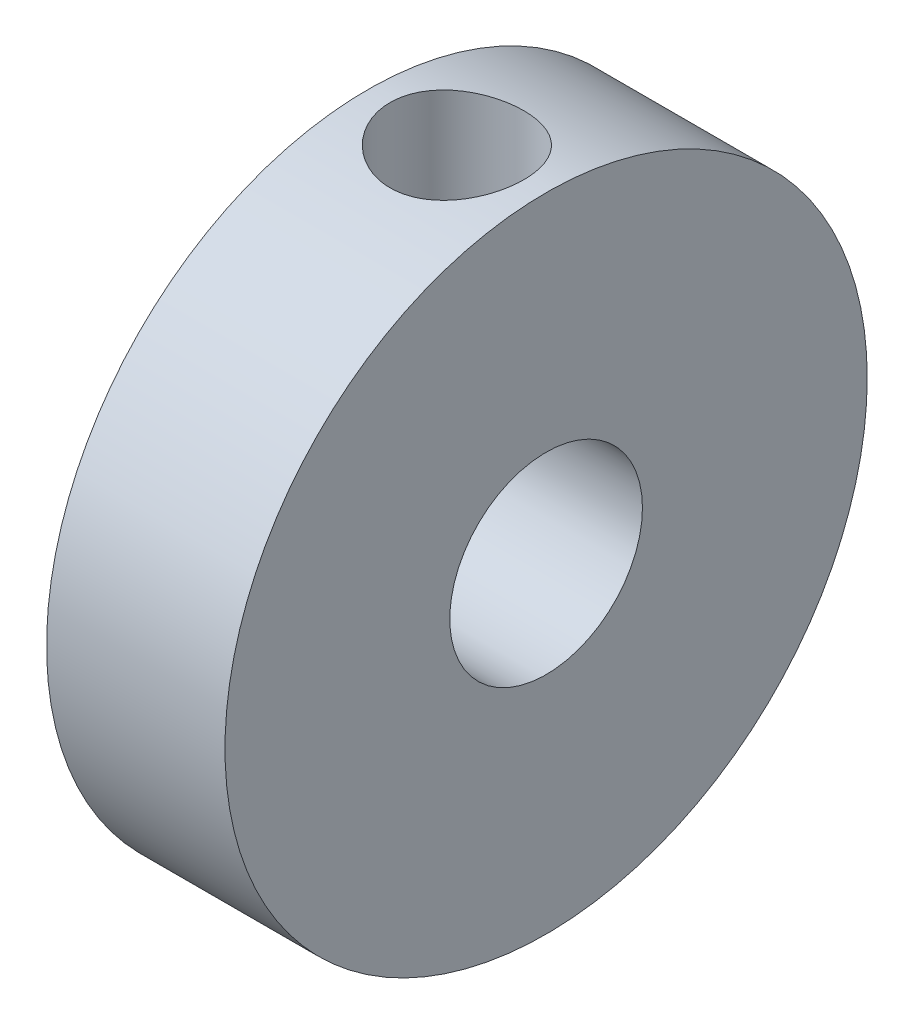
ISO-10303-21;
HEADER;
FILE_DESCRIPTION(('STEP AP214'),'2;1');
FILE_NAME('part.step','',(''),(''),'','','');
FILE_SCHEMA(('AUTOMOTIVE_DESIGN { 1 0 10303 214 1 1 1 1 }'));
ENDSEC;
DATA;
#1=APPLICATION_CONTEXT('core data for automotive mechanical design processes');
#2=APPLICATION_PROTOCOL_DEFINITION('international standard','automotive_design',2000,#1);
#3=PRODUCT_CONTEXT('',#1,'mechanical');
#4=PRODUCT('Part','Part','',(#3));
#5=PRODUCT_RELATED_PRODUCT_CATEGORY('part','',(#4));
#6=PRODUCT_DEFINITION_FORMATION('','',#4);
#7=PRODUCT_DEFINITION_CONTEXT('part definition',#1,'design');
#8=PRODUCT_DEFINITION('design','',#6,#7);
#9=PRODUCT_DEFINITION_SHAPE('','',#8);
#10=(LENGTH_UNIT() NAMED_UNIT(*) SI_UNIT(.MILLI.,.METRE.));
#11=(NAMED_UNIT(*) PLANE_ANGLE_UNIT() SI_UNIT($,.RADIAN.));
#12=(NAMED_UNIT(*) SI_UNIT($,.STERADIAN.) SOLID_ANGLE_UNIT());
#13=UNCERTAINTY_MEASURE_WITH_UNIT(LENGTH_MEASURE(1.E-05),#10,'distance_accuracy_value','');
#14=(GEOMETRIC_REPRESENTATION_CONTEXT(3) GLOBAL_UNCERTAINTY_ASSIGNED_CONTEXT((#13)) GLOBAL_UNIT_ASSIGNED_CONTEXT((#10,
#11,#12)) REPRESENTATION_CONTEXT('',''));
#15=CARTESIAN_POINT('',(0.,0.,0.));
#16=DIRECTION('',(0.,0.,1.));
#17=DIRECTION('',(1.,0.,0.));
#18=AXIS2_PLACEMENT_3D('',#15,#16,#17);
#19=CARTESIAN_POINT('',(6.35,0.,0.));
#20=DIRECTION('',(-1.,0.,0.));
#21=DIRECTION('',(0.,0.,1.));
#22=AXIS2_PLACEMENT_3D('',#19,#20,#21);
#23=CYLINDRICAL_SURFACE('',#22,11.43);
#24=CARTESIAN_POINT('',(6.35,0.,0.));
#25=DIRECTION('',(1.,0.,0.));
#26=DIRECTION('',(0.,0.,-1.));
#27=AXIS2_PLACEMENT_3D('',#24,#25,#26);
#28=CIRCLE('',#27,11.43);
#29=CARTESIAN_POINT('',(6.35,0.,-11.43));
#30=VERTEX_POINT('',#29);
#31=EDGE_CURVE('E10',#30,#30,#28,.T.);
#32=ORIENTED_EDGE('',*,*,#31,.F.);
#33=EDGE_LOOP('',(#32));
#34=FACE_BOUND('',#33,.T.);
#35=CARTESIAN_POINT('',(0.,0.,0.));
#36=DIRECTION('',(1.,0.,0.));
#37=DIRECTION('',(0.,0.,-1.));
#38=AXIS2_PLACEMENT_3D('',#35,#36,#37);
#39=CIRCLE('',#38,11.43);
#40=CARTESIAN_POINT('',(0.,0.,-11.43));
#41=VERTEX_POINT('',#40);
#42=EDGE_CURVE('E51',#41,#41,#39,.T.);
#43=ORIENTED_EDGE('',*,*,#42,.T.);
#44=EDGE_LOOP('',(#43));
#45=FACE_BOUND('',#44,.T.);
#46=CARTESIAN_POINT('',(3.175,11.179201601076,-2.38125));
#47=CARTESIAN_POINT('',(3.04281087813565,11.1792042585459,-2.38124525421922));
#48=CARTESIAN_POINT('',(2.91056319331057,11.1815717298695,-2.37020537071696));
#49=CARTESIAN_POINT('',(2.64981756551108,11.1907703968263,-2.32637931790323));
#50=CARTESIAN_POINT('',(2.52132257576038,11.1976050140344,-2.29357647913844));
#51=CARTESIAN_POINT('',(2.27189212974946,11.2149310809266,-2.2072929725128));
#52=CARTESIAN_POINT('',(2.15094896963558,11.2254187297178,-2.15383379079218));
#53=CARTESIAN_POINT('',(1.91974882817516,11.2488646244454,-2.02781513286298));
#54=CARTESIAN_POINT('',(1.80949141517932,11.2618227705236,-1.95525642861736));
#55=CARTESIAN_POINT('',(1.60109781033264,11.2889716053011,-1.79191234098289));
#56=CARTESIAN_POINT('',(1.50314934264157,11.3031768038064,-1.70088983202672));
#57=CARTESIAN_POINT('',(1.32379516422536,11.331091767589,-1.50371408149261));
#58=CARTESIAN_POINT('',(1.24239066680481,11.3448014964689,-1.39755973114368));
#59=CARTESIAN_POINT('',(1.09770058320215,11.3703379740141,-1.17188371096421));
#60=CARTESIAN_POINT('',(1.03459433708749,11.3821456119252,-1.05224471073041));
#61=CARTESIAN_POINT('',(0.929450669302118,11.4023841168899,-0.803773889667797));
#62=CARTESIAN_POINT('',(0.887411105882521,11.4108153271913,-0.674943004855872));
#63=CARTESIAN_POINT('',(0.826181175071214,11.423248487446,-0.413695332501952));
#64=CARTESIAN_POINT('',(0.806673487243206,11.4273118918366,-0.281355890645657));
#65=CARTESIAN_POINT('',(0.790070119582874,11.4307641446607,-0.0152244720392886));
#66=CARTESIAN_POINT('',(0.792972104312133,11.4301534802053,0.118567351898683));
#67=CARTESIAN_POINT('',(0.820866914822592,11.4243737366242,0.38162214671019));
#68=CARTESIAN_POINT('',(0.845517839615212,11.4192752111229,0.510923150223941));
#69=CARTESIAN_POINT('',(0.915667381256133,11.4051725331238,0.763512086681984));
#70=CARTESIAN_POINT('',(0.961166881071857,11.3961682152108,0.886799764708503));
#71=CARTESIAN_POINT('',(1.07203249929907,11.3751506175207,1.12482631025783));
#72=CARTESIAN_POINT('',(1.13753067046939,11.3631174335878,1.23950184214005));
#73=CARTESIAN_POINT('',(1.28643634541099,11.3373655733856,1.45636003465279));
#74=CARTESIAN_POINT('',(1.36984607578267,11.3236466876561,1.55854113961029));
#75=CARTESIAN_POINT('',(1.55407669541746,11.2957298894439,1.74954095724253));
#76=CARTESIAN_POINT('',(1.6551968292656,11.2815278237914,1.83807065867759));
#77=CARTESIAN_POINT('',(1.87099330333509,11.2544899239634,1.9969657274313));
#78=CARTESIAN_POINT('',(1.98566994544268,11.2416541202249,2.06733069013312));
#79=CARTESIAN_POINT('',(2.22576184544886,11.2187926196944,2.18801093648756));
#80=CARTESIAN_POINT('',(2.35120303957099,11.208773973672,2.23827604457931));
#81=CARTESIAN_POINT('',(2.60900853489868,11.1927819021174,2.31692915211172));
#82=CARTESIAN_POINT('',(2.74137184669942,11.1868079001618,2.34532026900875));
#83=CARTESIAN_POINT('',(3.00663554053751,11.1796979207055,2.37898045666669));
#84=CARTESIAN_POINT('',(3.13948048354304,11.1784743129992,2.38466838758788));
#85=CARTESIAN_POINT('',(3.40422067098397,11.1807679359563,2.37389086001856));
#86=CARTESIAN_POINT('',(3.53611597366895,11.1842848733075,2.35742677214229));
#87=CARTESIAN_POINT('',(3.79378308309072,11.1955809532085,2.30317468610047));
#88=CARTESIAN_POINT('',(3.91960481097567,11.2033147399411,2.2656134782294));
#89=CARTESIAN_POINT('',(4.16316919988625,11.2221328484844,2.17047719690052));
#90=CARTESIAN_POINT('',(4.28091114666401,11.2332174660396,2.11290035679459));
#91=CARTESIAN_POINT('',(4.50679777051692,11.2576832619035,1.97843009535729));
#92=CARTESIAN_POINT('',(4.61478414950805,11.2710945516506,1.90127634860931));
#93=CARTESIAN_POINT('',(4.81643038964039,11.2986213700839,1.73018660928563));
#94=CARTESIAN_POINT('',(4.91008864228573,11.3127369776024,1.63624873506236));
#95=CARTESIAN_POINT('',(5.08202446845009,11.3403683082338,1.43237035885657));
#96=CARTESIAN_POINT('',(5.16001780102526,11.3538700034143,1.32218793400573));
#97=CARTESIAN_POINT('',(5.2963865727276,11.3785023021143,1.09004119472217));
#98=CARTESIAN_POINT('',(5.35476287866234,11.3896330103916,0.968077401173465));
#99=CARTESIAN_POINT('',(5.44983418409955,11.4082096245564,0.716550734500292));
#100=CARTESIAN_POINT('',(5.48665876036197,11.4156775077502,0.587038534398228));
#101=CARTESIAN_POINT('',(5.53798943963542,11.4261816448648,0.323494527959119));
#102=CARTESIAN_POINT('',(5.55249847117985,11.4292184802822,0.189463317024529));
#103=CARTESIAN_POINT('',(5.55866482000243,11.4305030734846,-0.0766064193109848));
#104=CARTESIAN_POINT('',(5.55074816949,11.4288401170286,-0.208634823098914));
#105=CARTESIAN_POINT('',(5.51323388336613,11.4211012515002,-0.469435568061633));
#106=CARTESIAN_POINT('',(5.48363656939496,11.4150254078945,-0.598207957511224));
#107=CARTESIAN_POINT('',(5.40379705119463,11.3991477644753,-0.848547894262276));
#108=CARTESIAN_POINT('',(5.35361007536036,11.3893559374069,-0.970133727758316));
#109=CARTESIAN_POINT('',(5.23407183232001,11.3670968113809,-1.20321813055581));
#110=CARTESIAN_POINT('',(5.16471889645436,11.3546292794876,-1.31471582042358));
#111=CARTESIAN_POINT('',(5.00740108247475,11.3281129187537,-1.52655331207205));
#112=CARTESIAN_POINT('',(4.91913363125951,11.3140403696681,-1.62666546703408));
#113=CARTESIAN_POINT('',(4.72710922559302,11.2860350888575,-1.81080297347688));
#114=CARTESIAN_POINT('',(4.62334858292011,11.27210239127,-1.89482448360908));
#115=CARTESIAN_POINT('',(4.40180265988891,11.2457711004222,-2.04534995778175));
#116=CARTESIAN_POINT('',(4.28386542626335,11.2333926962466,-2.11163398076349));
#117=CARTESIAN_POINT('',(4.0382980777608,11.2118211040776,-2.22333746192143));
#118=CARTESIAN_POINT('',(3.91067661772323,11.202625111889,-2.26877530035783));
#119=CARTESIAN_POINT('',(3.68152753359657,11.1902367841668,-2.32898735622105));
#120=CARTESIAN_POINT('',(3.58128023278603,11.1861250164867,-2.34854970356047));
#121=CARTESIAN_POINT('',(3.37903353811168,11.1806064537652,-2.37468259552514));
#122=CARTESIAN_POINT('',(3.27703421495062,11.1791995498266,-2.38125366317597));
#123=CARTESIAN_POINT('',(3.175,11.179201601076,-2.38125));
#124=B_SPLINE_CURVE_WITH_KNOTS('',3,(#46,#47,#48,#49,#50,#51,#52,#53,#54,#55,#56,#57,#58,#59,
#60,#61,#62,#63,#64,#65,#66,#67,#68,#69,#70,#71,#72,#73,#74,#75,#76,#77,#78,#79,#80,#81,#82,#83,
#84,#85,#86,#87,#88,#89,#90,#91,#92,#93,#94,#95,#96,#97,#98,#99,#100,#101,#102,#103,#104,#105,
#106,#107,#108,#109,#110,#111,#112,#113,#114,#115,#116,#117,#118,#119,#120,#121,#122,#123),
.UNSPECIFIED.,.T.,.F.,(4,2,2,2,2,2,2,2,2,2,2,2,2,2,2,2,2,2,2,2,2,2,2,2,2,2,2,2,2,2,2,2,2,2,2,2,
2,2,4),(0.,0.39619362100577,0.792691059555282,1.1887771781992,1.58484729032408,1.98636890256321,
2.3879199510468,2.79328295038338,3.19860473003708,3.59814588076899,3.99764539362526,
4.39097435398359,4.78431997393434,5.18032121117994,5.57637170418616,5.9799066757656,
6.38345063525052,6.7879957711839,7.19248324113373,7.58947267998655,7.98643755699879,
8.37921462771813,8.77202637508979,9.17036363665511,9.56874558336565,9.9738076892512,
10.3788518945097,10.7814351233046,11.18396551543,11.5789003992264,11.9738294241433,
12.3677059716462,12.7616168223117,13.1623749765418,13.5632286855446,13.9688440083862,
14.3741010061278,14.6799274775403,14.9857416362065),.UNSPECIFIED.);
#125=CARTESIAN_POINT('',(3.175,11.179201601076,-2.38125));
#126=VERTEX_POINT('',#125);
#127=EDGE_CURVE('E63',#126,#126,#124,.T.);
#128=ORIENTED_EDGE('',*,*,#127,.F.);
#129=EDGE_LOOP('',(#128));
#130=FACE_BOUND('',#129,.T.);
#131=ADVANCED_FACE('F37',(#34,#45,#130),#23,.T.);
#132=CARTESIAN_POINT('',(6.35,0.,0.));
#133=DIRECTION('',(-1.,0.,0.));
#134=DIRECTION('',(0.,0.,1.));
#135=AXIS2_PLACEMENT_3D('',#132,#133,#134);
#136=CYLINDRICAL_SURFACE('',#135,3.429);
#137=CARTESIAN_POINT('',(0.,0.,0.));
#138=DIRECTION('',(1.,0.,0.));
#139=DIRECTION('',(0.,0.,-1.));
#140=AXIS2_PLACEMENT_3D('',#137,#138,#139);
#141=CIRCLE('',#140,3.429);
#142=CARTESIAN_POINT('',(0.,0.,-3.429));
#143=VERTEX_POINT('',#142);
#144=EDGE_CURVE('E59',#143,#143,#141,.T.);
#145=ORIENTED_EDGE('',*,*,#144,.F.);
#146=EDGE_LOOP('',(#145));
#147=FACE_BOUND('',#146,.T.);
#148=CARTESIAN_POINT('',(6.35,0.,0.));
#149=DIRECTION('',(1.,0.,0.));
#150=DIRECTION('',(0.,0.,-1.));
#151=AXIS2_PLACEMENT_3D('',#148,#149,#150);
#152=CIRCLE('',#151,3.429);
#153=CARTESIAN_POINT('',(6.35,0.,-3.429));
#154=VERTEX_POINT('',#153);
#155=EDGE_CURVE('E57',#154,#154,#152,.T.);
#156=ORIENTED_EDGE('',*,*,#155,.T.);
#157=EDGE_LOOP('',(#156));
#158=FACE_BOUND('',#157,.T.);
#159=CARTESIAN_POINT('',(3.175,2.46732434785134,-2.38125));
#160=CARTESIAN_POINT('',(3.06037405181945,2.46733633740365,-2.38124406741929));
#161=CARTESIAN_POINT('',(2.94571129989525,2.47547025231211,-2.37289592677023));
#162=CARTESIAN_POINT('',(2.720612198363,2.5063136497309,-2.3402763555674));
#163=CARTESIAN_POINT('',(2.61018558353344,2.52905479539753,-2.31597033159555));
#164=CARTESIAN_POINT('',(2.39763070126893,2.58486880421144,-2.25348807111579));
#165=CARTESIAN_POINT('',(2.29542588959996,2.61782779399106,-2.21546398685473));
#166=CARTESIAN_POINT('',(2.09906859226291,2.69016236980005,-2.12704731665927));
#167=CARTESIAN_POINT('',(2.00491690926002,2.7295385943093,-2.0766534997511));
#168=CARTESIAN_POINT('',(1.80963217216772,2.81835076614098,-1.95487539498556));
#169=CARTESIAN_POINT('',(1.71007634012784,2.86835308784782,-1.88137266178494));
#170=CARTESIAN_POINT('',(1.52331727176549,2.96808359535822,-1.71976201178572));
#171=CARTESIAN_POINT('',(1.43612907767595,3.01781137782228,-1.63163658780595));
#172=CARTESIAN_POINT('',(1.26239271936895,3.12091313264645,-1.42589601943398));
#173=CARTESIAN_POINT('',(1.17825778009841,3.17356350273457,-1.30581566023669));
#174=CARTESIAN_POINT('',(1.06875641324941,3.24394631330809,-1.11334770192322));
#175=CARTESIAN_POINT('',(1.03504531659949,3.26597103558082,-1.0471505057851));
#176=CARTESIAN_POINT('',(0.973642591281808,3.30652836979183,-0.911015873868159));
#177=CARTESIAN_POINT('',(0.945948398173873,3.32506246900425,-0.8410800474149));
#178=CARTESIAN_POINT('',(0.885663892197597,3.36571544322973,-0.664513400699107));
#179=CARTESIAN_POINT('',(0.856830397365408,3.38546402980708,-0.556003040962064));
#180=CARTESIAN_POINT('',(0.814704639741052,3.4144471579132,-0.334711196276552));
#181=CARTESIAN_POINT('',(0.801400086510079,3.42369001408962,-0.221933162086401));
#182=CARTESIAN_POINT('',(0.791045072389614,3.43087677102221,0.0049580393152334));
#183=CARTESIAN_POINT('',(0.794025083394327,3.42879948940534,0.119073310544319));
#184=CARTESIAN_POINT('',(0.816135958916685,3.413483104613,0.344966462378236));
#185=CARTESIAN_POINT('',(0.835271396096951,3.40024084128125,0.45674367203347));
#186=CARTESIAN_POINT('',(0.88804443793036,3.36414854879464,0.672506180505722));
#187=CARTESIAN_POINT('',(0.921359625459846,3.34151238672026,0.776607680664938));
#188=CARTESIAN_POINT('',(1.0009547147023,3.28835624342393,0.977531981049106));
#189=CARTESIAN_POINT('',(1.04723713490419,3.25783473080323,1.07435336269547));
#190=CARTESIAN_POINT('',(1.1570951907715,3.1871087707374,1.26978600106195));
#191=CARTESIAN_POINT('',(1.22203009905247,3.14620146615508,1.36737453650869));
#192=CARTESIAN_POINT('',(1.3643118911656,3.05991482051075,1.5508928741957));
#193=CARTESIAN_POINT('',(1.44167242183787,3.01453058390642,1.63680966383326));
#194=CARTESIAN_POINT('',(1.62212719499465,2.91418870472672,1.8103209082213));
#195=CARTESIAN_POINT('',(1.72735397785156,2.85895312327422,1.89554410831003));
#196=CARTESIAN_POINT('',(1.95198952488605,2.75203287552301,2.04767794105543));
#197=CARTESIAN_POINT('',(2.07139350218704,2.70034701992406,2.11459472973102));
#198=CARTESIAN_POINT('',(2.29393651572429,2.61838439848314,2.21478638354187));
#199=CARTESIAN_POINT('',(2.39436489343765,2.58592652534118,2.25226808381948));
#200=CARTESIAN_POINT('',(2.60182613735452,2.53106050766234,2.31375947364055));
#201=CARTESIAN_POINT('',(2.708846256214,2.50863361855074,2.33779431217002));
#202=CARTESIAN_POINT('',(2.92829479265609,2.47723900466284,2.37105256224148));
#203=CARTESIAN_POINT('',(3.04076525072269,2.46840248759938,2.38013164284504));
#204=CARTESIAN_POINT('',(3.26598461822115,2.46643573830061,2.38217196795299));
#205=CARTESIAN_POINT('',(3.37873345066377,2.47330156377294,2.37513725804881));
#206=CARTESIAN_POINT('',(3.58559069691782,2.49942059592685,2.34759680756977));
#207=CARTESIAN_POINT('',(3.68019657998641,2.51692091636562,2.32898978837144));
#208=CARTESIAN_POINT('',(3.8646884525531,2.56033306257714,2.28117897543619));
#209=CARTESIAN_POINT('',(3.95456954774756,2.58625341847913,2.25196443193038));
#210=CARTESIAN_POINT('',(4.16928275106762,2.65739122246915,2.16807720154182));
#211=CARTESIAN_POINT('',(4.29084454630058,2.70596843418287,2.10788657350589));
#212=CARTESIAN_POINT('',(4.52060433094421,2.80851143502909,1.96920501838975));
#213=CARTESIAN_POINT('',(4.62877588265348,2.86248751562457,1.89067874421846));
#214=CARTESIAN_POINT('',(4.83244421426423,2.97107459296139,1.71511113833311));
#215=CARTESIAN_POINT('',(4.92768606614226,3.02568017117174,1.61776984946622));
#216=CARTESIAN_POINT('',(5.10124655419058,3.12942364192865,1.40660796416132));
#217=CARTESIAN_POINT('',(5.17959054411641,3.17856967154893,1.29281249042613));
#218=CARTESIAN_POINT('',(5.30526114305903,3.25941722448491,1.07043564174399));
#219=CARTESIAN_POINT('',(5.35557551242854,3.29265974826067,0.96410978657079));
#220=CARTESIAN_POINT('',(5.44049068524456,3.34949821359433,0.742905634638622));
#221=CARTESIAN_POINT('',(5.47510120175991,3.37310011711688,0.628032675715845));
#222=CARTESIAN_POINT('',(5.52689473599206,3.40862709031161,0.391938078825934));
#223=CARTESIAN_POINT('',(5.54398148045728,3.42048764233645,0.270685176639968));
#224=CARTESIAN_POINT('',(5.55924154426762,3.43107326564135,0.0264295131237532));
#225=CARTESIAN_POINT('',(5.55742130412388,3.42980280989358,-0.0965726380818177));
#226=CARTESIAN_POINT('',(5.53606717406919,3.41500826235915,-0.328687452920695));
#227=CARTESIAN_POINT('',(5.51818607389447,3.40262760467193,-0.438033093567841));
#228=CARTESIAN_POINT('',(5.46795356494886,3.36823264356598,-0.651744636805477));
#229=CARTESIAN_POINT('',(5.43559931475662,3.34621644848195,-0.756109557108154));
#230=CARTESIAN_POINT('',(5.35632785694987,3.29317158354084,-0.961652970987369));
#231=CARTESIAN_POINT('',(5.30888786814731,3.26182246806188,-1.06254464190499));
#232=CARTESIAN_POINT('',(5.20165055874881,3.1926982541919,-1.25506754610067));
#233=CARTESIAN_POINT('',(5.14185071829192,3.15492184571662,-1.34669688534243));
#234=CARTESIAN_POINT('',(5.00111999129769,3.06900900863048,-1.53341969343941));
#235=CARTESIAN_POINT('',(4.9183456350937,3.02017714496778,-1.62679951464317));
#236=CARTESIAN_POINT('',(4.73966761182532,2.92067374320381,-1.79934332122901));
#237=CARTESIAN_POINT('',(4.64373585419102,2.86999844426099,-1.87847603027649));
#238=CARTESIAN_POINT('',(4.48316026433405,2.79219621153892,-1.99102754711707));
#239=CARTESIAN_POINT('',(4.42250237261896,2.76419722144082,-2.02960041129541));
#240=CARTESIAN_POINT('',(4.29734562766028,2.71000932266355,-2.1014075425891));
#241=CARTESIAN_POINT('',(4.23284567673157,2.68382093594017,-2.13464027389146));
#242=CARTESIAN_POINT('',(4.034116984522,2.60974419260672,-2.22561597361502));
#243=CARTESIAN_POINT('',(3.89411796265985,2.56606340783824,-2.27502076639867));
#244=CARTESIAN_POINT('',(3.65611444459926,2.51218549809424,-2.33408412673047));
#245=CARTESIAN_POINT('',(3.56148465852744,2.49558488253024,-2.351671209887));
#246=CARTESIAN_POINT('',(3.36957629834059,2.47315635746676,-2.37524897961546));
#247=CARTESIAN_POINT('',(3.27230140889101,2.46731417039719,-2.38125503593183));
#248=CARTESIAN_POINT('',(3.175,2.46732434785134,-2.38125));
#249=B_SPLINE_CURVE_WITH_KNOTS('',3,(#159,#160,#161,#162,#163,#164,#165,#166,#167,#168,#169,
#170,#171,#172,#173,#174,#175,#176,#177,#178,#179,#180,#181,#182,#183,#184,#185,#186,#187,#188,
#189,#190,#191,#192,#193,#194,#195,#196,#197,#198,#199,#200,#201,#202,#203,#204,#205,#206,#207,
#208,#209,#210,#211,#212,#213,#214,#215,#216,#217,#218,#219,#220,#221,#222,#223,#224,#225,#226,
#227,#228,#229,#230,#231,#232,#233,#234,#235,#236,#237,#238,#239,#240,#241,#242,#243,#244,#245,
#246,#247,#248),.UNSPECIFIED.,.T.,.F.,(4,2,2,2,2,2,2,2,2,2,2,2,2,2,2,2,2,2,2,2,2,2,2,2,2,2,2,2,
2,2,2,2,2,2,2,2,2,2,2,2,2,2,2,2,4),(0.,0.343412129450252,0.687571174974383,1.02802480560608,
1.36851233022138,1.76746489439345,2.16689860184972,2.63133542866099,2.86344677977557,
3.09545900873208,3.43585974196753,3.77599088069466,4.11675869503422,4.45762299329364,
4.7911192309051,5.12468028492926,5.49574504018402,5.86722015149678,6.30414201752469,
6.74091677581507,7.07572289060287,7.40990072312231,7.74728504779578,8.08458467672244,
8.37740537189837,8.67052364647817,9.10047045208837,9.53125304521444,9.96957412381054,
10.4072328933207,10.772438011824,11.1374169365212,11.5043904358917,11.8712389328129,
12.2041803096687,12.5371870794904,12.8832928678948,13.2294692882358,13.6299809652739,
14.0313614309121,14.2625101414808,14.4937252114964,14.9540217788874,15.2459183360237,
15.5374272356765),.UNSPECIFIED.);
#250=CARTESIAN_POINT('',(3.175,2.46732434785134,-2.38125));
#251=VERTEX_POINT('',#250);
#252=EDGE_CURVE('E41',#251,#251,#249,.T.);
#253=ORIENTED_EDGE('',*,*,#252,.T.);
#254=EDGE_LOOP('',(#253));
#255=FACE_BOUND('',#254,.T.);
#256=ADVANCED_FACE('F77',(#147,#158,#255),#136,.F.);
#257=CARTESIAN_POINT('',(6.35,0.,0.));
#258=DIRECTION('',(1.,0.,0.));
#259=DIRECTION('',(0.,0.,-1.));
#260=AXIS2_PLACEMENT_3D('',#257,#258,#259);
#261=PLANE('',#260);
#262=ORIENTED_EDGE('',*,*,#31,.T.);
#263=EDGE_LOOP('',(#262));
#264=FACE_BOUND('',#263,.T.);
#265=ORIENTED_EDGE('',*,*,#155,.F.);
#266=EDGE_LOOP('',(#265));
#267=FACE_BOUND('',#266,.T.);
#268=ADVANCED_FACE('F82',(#264,#267),#261,.T.);
#269=CARTESIAN_POINT('',(0.,0.,0.));
#270=DIRECTION('',(1.,0.,0.));
#271=DIRECTION('',(0.,0.,-1.));
#272=AXIS2_PLACEMENT_3D('',#269,#270,#271);
#273=PLANE('',#272);
#274=ORIENTED_EDGE('',*,*,#42,.F.);
#275=EDGE_LOOP('',(#274));
#276=FACE_BOUND('',#275,.T.);
#277=ORIENTED_EDGE('',*,*,#144,.T.);
#278=EDGE_LOOP('',(#277));
#279=FACE_BOUND('',#278,.T.);
#280=ADVANCED_FACE('F75',(#276,#279),#273,.F.);
#281=CARTESIAN_POINT('',(3.175,14.986,0.));
#282=DIRECTION('',(0.,-1.,0.));
#283=DIRECTION('',(0.,0.,-1.));
#284=AXIS2_PLACEMENT_3D('',#281,#282,#283);
#285=CYLINDRICAL_SURFACE('',#284,2.38125);
#286=ORIENTED_EDGE('',*,*,#252,.F.);
#287=EDGE_LOOP('',(#286));
#288=FACE_BOUND('',#287,.T.);
#289=ORIENTED_EDGE('',*,*,#127,.T.);
#290=EDGE_LOOP('',(#289));
#291=FACE_BOUND('',#290,.T.);
#292=ADVANCED_FACE('F72',(#288,#291),#285,.F.);
#293=CLOSED_SHELL('',(#131,#256,#268,#280,#292));
#294=MANIFOLD_SOLID_BREP('B2',#293);
#295=ADVANCED_BREP_SHAPE_REPRESENTATION('',(#18,#294),#14);
#296=SHAPE_DEFINITION_REPRESENTATION(#9,#295);
ENDSEC;
END-ISO-10303-21;
